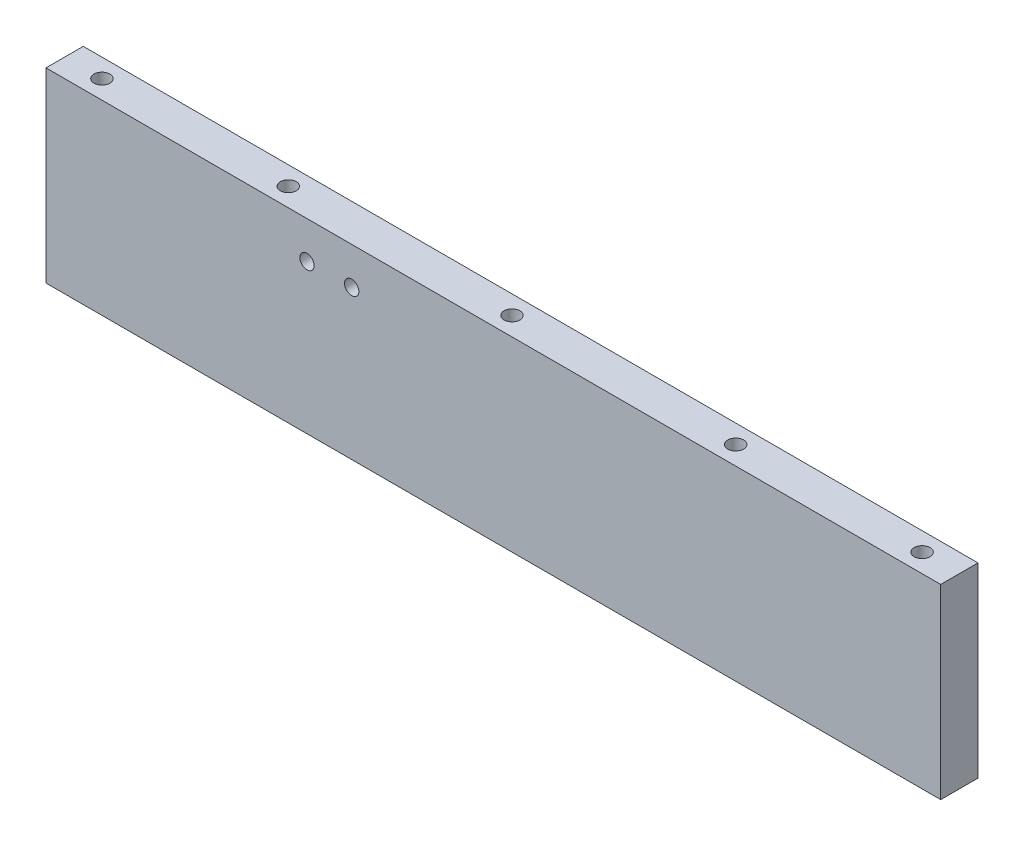
ISO-10303-21;
HEADER;
FILE_DESCRIPTION(('STEP AP214'),'2;1');
FILE_NAME('part.step','',(''),(''),'','','');
FILE_SCHEMA(('AUTOMOTIVE_DESIGN { 1 0 10303 214 1 1 1 1 }'));
ENDSEC;
DATA;
#1=APPLICATION_CONTEXT('core data for automotive mechanical design processes');
#2=APPLICATION_PROTOCOL_DEFINITION('international standard','automotive_design',2000,#1);
#3=PRODUCT_CONTEXT('',#1,'mechanical');
#4=PRODUCT('Part','Part','',(#3));
#5=PRODUCT_RELATED_PRODUCT_CATEGORY('part','',(#4));
#6=PRODUCT_DEFINITION_FORMATION('','',#4);
#7=PRODUCT_DEFINITION_CONTEXT('part definition',#1,'design');
#8=PRODUCT_DEFINITION('design','',#6,#7);
#9=PRODUCT_DEFINITION_SHAPE('','',#8);
#10=(LENGTH_UNIT() NAMED_UNIT(*) SI_UNIT(.MILLI.,.METRE.));
#11=(NAMED_UNIT(*) PLANE_ANGLE_UNIT() SI_UNIT($,.RADIAN.));
#12=(NAMED_UNIT(*) SI_UNIT($,.STERADIAN.) SOLID_ANGLE_UNIT());
#13=UNCERTAINTY_MEASURE_WITH_UNIT(LENGTH_MEASURE(1.E-05),#10,'distance_accuracy_value','');
#14=(GEOMETRIC_REPRESENTATION_CONTEXT(3) GLOBAL_UNCERTAINTY_ASSIGNED_CONTEXT((#13)) GLOBAL_UNIT_ASSIGNED_CONTEXT((#10,
#11,#12)) REPRESENTATION_CONTEXT('',''));
#15=CARTESIAN_POINT('',(0.,0.,0.));
#16=DIRECTION('',(0.,0.,1.));
#17=DIRECTION('',(1.,0.,0.));
#18=AXIS2_PLACEMENT_3D('',#15,#16,#17);
#19=CARTESIAN_POINT('',(76.2,-15.875,-6.35));
#20=DIRECTION('',(1.,0.,0.));
#21=DIRECTION('',(0.,0.,-1.));
#22=AXIS2_PLACEMENT_3D('',#19,#20,#21);
#23=PLANE('',#22);
#24=DIRECTION('',(0.,1.,0.));
#25=VECTOR('',#24,1.);
#26=CARTESIAN_POINT('',(76.2,-15.875,0.));
#27=LINE('',#26,#25);
#28=CARTESIAN_POINT('',(76.2,-15.875,0.));
#29=VERTEX_POINT('',#28);
#30=CARTESIAN_POINT('',(76.2,15.875,0.));
#31=VERTEX_POINT('',#30);
#32=EDGE_CURVE('E201',#29,#31,#27,.T.);
#33=ORIENTED_EDGE('',*,*,#32,.F.);
#34=DIRECTION('',(0.,0.,1.));
#35=VECTOR('',#34,1.);
#36=CARTESIAN_POINT('',(76.2,-15.875,-6.35));
#37=LINE('',#36,#35);
#38=CARTESIAN_POINT('',(76.2,-15.875,-6.35));
#39=VERTEX_POINT('',#38);
#40=EDGE_CURVE('E12',#39,#29,#37,.T.);
#41=ORIENTED_EDGE('',*,*,#40,.F.);
#42=DIRECTION('',(0.,1.,0.));
#43=VECTOR('',#42,1.);
#44=CARTESIAN_POINT('',(76.2,-15.875,-6.35));
#45=LINE('',#44,#43);
#46=CARTESIAN_POINT('',(76.2,15.875,-6.35));
#47=VERTEX_POINT('',#46);
#48=EDGE_CURVE('E202',#39,#47,#45,.T.);
#49=ORIENTED_EDGE('',*,*,#48,.T.);
#50=DIRECTION('',(0.,0.,1.));
#51=VECTOR('',#50,1.);
#52=CARTESIAN_POINT('',(76.2,15.875,-6.35));
#53=LINE('',#52,#51);
#54=EDGE_CURVE('E41',#47,#31,#53,.T.);
#55=ORIENTED_EDGE('',*,*,#54,.T.);
#56=EDGE_LOOP('',(#33,#41,#49,#55));
#57=FACE_BOUND('',#56,.T.);
#58=ADVANCED_FACE('F38',(#57),#23,.T.);
#59=CARTESIAN_POINT('',(-76.2,-15.875,-6.35));
#60=DIRECTION('',(0.,-1.,0.));
#61=DIRECTION('',(0.,0.,-1.));
#62=AXIS2_PLACEMENT_3D('',#59,#60,#61);
#63=PLANE('',#62);
#64=CARTESIAN_POINT('',(-69.85,-15.875,-3.175));
#65=DIRECTION('',(0.,-1.,0.));
#66=DIRECTION('',(0.,0.,-1.));
#67=AXIS2_PLACEMENT_3D('',#64,#65,#66);
#68=CIRCLE('',#67,1.35254999999999);
#69=CARTESIAN_POINT('',(-69.85,-15.875,-4.52754999999999));
#70=VERTEX_POINT('',#69);
#71=EDGE_CURVE('E125',#70,#70,#68,.T.);
#72=ORIENTED_EDGE('',*,*,#71,.F.);
#73=EDGE_LOOP('',(#72));
#74=FACE_BOUND('',#73,.T.);
#75=CARTESIAN_POINT('',(-38.1,-15.875,-3.175));
#76=DIRECTION('',(0.,-1.,0.));
#77=DIRECTION('',(0.,0.,-1.));
#78=AXIS2_PLACEMENT_3D('',#75,#76,#77);
#79=CIRCLE('',#78,1.35254999999999);
#80=CARTESIAN_POINT('',(-38.1,-15.875,-4.52754999999999));
#81=VERTEX_POINT('',#80);
#82=EDGE_CURVE('E124',#81,#81,#79,.T.);
#83=ORIENTED_EDGE('',*,*,#82,.F.);
#84=EDGE_LOOP('',(#83));
#85=FACE_BOUND('',#84,.T.);
#86=CARTESIAN_POINT('',(0.,-15.875,-3.175));
#87=DIRECTION('',(0.,-1.,0.));
#88=DIRECTION('',(0.,0.,-1.));
#89=AXIS2_PLACEMENT_3D('',#86,#87,#88);
#90=CIRCLE('',#89,1.35254999999999);
#91=CARTESIAN_POINT('',(0.,-15.875,-4.52754999999999));
#92=VERTEX_POINT('',#91);
#93=EDGE_CURVE('E135',#92,#92,#90,.T.);
#94=ORIENTED_EDGE('',*,*,#93,.F.);
#95=EDGE_LOOP('',(#94));
#96=FACE_BOUND('',#95,.T.);
#97=CARTESIAN_POINT('',(38.1,-15.875,-3.175));
#98=DIRECTION('',(0.,-1.,0.));
#99=DIRECTION('',(0.,0.,-1.));
#100=AXIS2_PLACEMENT_3D('',#97,#98,#99);
#101=CIRCLE('',#100,1.35254999999999);
#102=CARTESIAN_POINT('',(38.1,-15.875,-4.52754999999999));
#103=VERTEX_POINT('',#102);
#104=EDGE_CURVE('E141',#103,#103,#101,.T.);
#105=ORIENTED_EDGE('',*,*,#104,.F.);
#106=EDGE_LOOP('',(#105));
#107=FACE_BOUND('',#106,.T.);
#108=CARTESIAN_POINT('',(69.85,-15.875,-3.175));
#109=DIRECTION('',(0.,-1.,0.));
#110=DIRECTION('',(0.,0.,-1.));
#111=AXIS2_PLACEMENT_3D('',#108,#109,#110);
#112=CIRCLE('',#111,1.35254999999999);
#113=CARTESIAN_POINT('',(69.85,-15.875,-4.52754999999999));
#114=VERTEX_POINT('',#113);
#115=EDGE_CURVE('E147',#114,#114,#112,.T.);
#116=ORIENTED_EDGE('',*,*,#115,.F.);
#117=EDGE_LOOP('',(#116));
#118=FACE_BOUND('',#117,.T.);
#119=DIRECTION('',(1.,0.,0.));
#120=VECTOR('',#119,1.);
#121=CARTESIAN_POINT('',(-76.2,-15.875,0.));
#122=LINE('',#121,#120);
#123=CARTESIAN_POINT('',(-76.2,-15.875,0.));
#124=VERTEX_POINT('',#123);
#125=EDGE_CURVE('E205',#124,#29,#122,.T.);
#126=ORIENTED_EDGE('',*,*,#125,.F.);
#127=DIRECTION('',(0.,0.,1.));
#128=VECTOR('',#127,1.);
#129=CARTESIAN_POINT('',(-76.2,-15.875,-6.35));
#130=LINE('',#129,#128);
#131=CARTESIAN_POINT('',(-76.2,-15.875,-6.35));
#132=VERTEX_POINT('',#131);
#133=EDGE_CURVE('E47',#132,#124,#130,.T.);
#134=ORIENTED_EDGE('',*,*,#133,.F.);
#135=DIRECTION('',(1.,0.,0.));
#136=VECTOR('',#135,1.);
#137=CARTESIAN_POINT('',(-76.2,-15.875,-6.35));
#138=LINE('',#137,#136);
#139=EDGE_CURVE('E209',#132,#39,#138,.T.);
#140=ORIENTED_EDGE('',*,*,#139,.T.);
#141=ORIENTED_EDGE('',*,*,#40,.T.);
#142=EDGE_LOOP('',(#126,#134,#140,#141));
#143=FACE_BOUND('',#142,.T.);
#144=ADVANCED_FACE('F226',(#74,#85,#96,#107,#118,#143),#63,.T.);
#145=CARTESIAN_POINT('',(-76.2,-15.875,-6.35));
#146=DIRECTION('',(-1.,0.,0.));
#147=DIRECTION('',(0.,0.,1.));
#148=AXIS2_PLACEMENT_3D('',#145,#146,#147);
#149=PLANE('',#148);
#150=DIRECTION('',(0.,-1.,0.));
#151=VECTOR('',#150,1.);
#152=CARTESIAN_POINT('',(-76.2,-15.875,0.));
#153=LINE('',#152,#151);
#154=CARTESIAN_POINT('',(-76.2,15.875,0.));
#155=VERTEX_POINT('',#154);
#156=EDGE_CURVE('E217',#155,#124,#153,.T.);
#157=ORIENTED_EDGE('',*,*,#156,.F.);
#158=DIRECTION('',(0.,0.,1.));
#159=VECTOR('',#158,1.);
#160=CARTESIAN_POINT('',(-76.2,15.875,-6.35));
#161=LINE('',#160,#159);
#162=CARTESIAN_POINT('',(-76.2,15.875,-6.35));
#163=VERTEX_POINT('',#162);
#164=EDGE_CURVE('E222',#163,#155,#161,.T.);
#165=ORIENTED_EDGE('',*,*,#164,.F.);
#166=DIRECTION('',(0.,-1.,0.));
#167=VECTOR('',#166,1.);
#168=CARTESIAN_POINT('',(-76.2,-15.875,-6.35));
#169=LINE('',#168,#167);
#170=EDGE_CURVE('E207',#163,#132,#169,.T.);
#171=ORIENTED_EDGE('',*,*,#170,.T.);
#172=ORIENTED_EDGE('',*,*,#133,.T.);
#173=EDGE_LOOP('',(#157,#165,#171,#172));
#174=FACE_BOUND('',#173,.T.);
#175=ADVANCED_FACE('F229',(#174),#149,.T.);
#176=CARTESIAN_POINT('',(-76.2,15.875,-6.35));
#177=DIRECTION('',(0.,1.,0.));
#178=DIRECTION('',(0.,0.,1.));
#179=AXIS2_PLACEMENT_3D('',#176,#177,#178);
#180=PLANE('',#179);
#181=CARTESIAN_POINT('',(-69.85,15.875,-3.175));
#182=DIRECTION('',(0.,1.,0.));
#183=DIRECTION('',(0.,0.,1.));
#184=AXIS2_PLACEMENT_3D('',#181,#182,#183);
#185=CIRCLE('',#184,1.35254999999999);
#186=CARTESIAN_POINT('',(-69.85,15.875,-1.82245000000001));
#187=VERTEX_POINT('',#186);
#188=EDGE_CURVE('E153',#187,#187,#185,.T.);
#189=ORIENTED_EDGE('',*,*,#188,.F.);
#190=EDGE_LOOP('',(#189));
#191=FACE_BOUND('',#190,.T.);
#192=CARTESIAN_POINT('',(-38.1,15.875,-3.175));
#193=DIRECTION('',(0.,1.,0.));
#194=DIRECTION('',(0.,0.,1.));
#195=AXIS2_PLACEMENT_3D('',#192,#193,#194);
#196=CIRCLE('',#195,1.35254999999999);
#197=CARTESIAN_POINT('',(-38.1,15.875,-1.82245000000001));
#198=VERTEX_POINT('',#197);
#199=EDGE_CURVE('E159',#198,#198,#196,.T.);
#200=ORIENTED_EDGE('',*,*,#199,.F.);
#201=EDGE_LOOP('',(#200));
#202=FACE_BOUND('',#201,.T.);
#203=CARTESIAN_POINT('',(0.,15.875,-3.175));
#204=DIRECTION('',(0.,1.,0.));
#205=DIRECTION('',(0.,0.,1.));
#206=AXIS2_PLACEMENT_3D('',#203,#204,#205);
#207=CIRCLE('',#206,1.35254999999999);
#208=CARTESIAN_POINT('',(0.,15.875,-1.82245000000001));
#209=VERTEX_POINT('',#208);
#210=EDGE_CURVE('E165',#209,#209,#207,.T.);
#211=ORIENTED_EDGE('',*,*,#210,.F.);
#212=EDGE_LOOP('',(#211));
#213=FACE_BOUND('',#212,.T.);
#214=CARTESIAN_POINT('',(38.1,15.875,-3.175));
#215=DIRECTION('',(0.,1.,0.));
#216=DIRECTION('',(0.,0.,1.));
#217=AXIS2_PLACEMENT_3D('',#214,#215,#216);
#218=CIRCLE('',#217,1.35254999999999);
#219=CARTESIAN_POINT('',(38.1,15.875,-1.82245000000001));
#220=VERTEX_POINT('',#219);
#221=EDGE_CURVE('E171',#220,#220,#218,.T.);
#222=ORIENTED_EDGE('',*,*,#221,.F.);
#223=EDGE_LOOP('',(#222));
#224=FACE_BOUND('',#223,.T.);
#225=CARTESIAN_POINT('',(69.85,15.875,-3.175));
#226=DIRECTION('',(0.,1.,0.));
#227=DIRECTION('',(0.,0.,1.));
#228=AXIS2_PLACEMENT_3D('',#225,#226,#227);
#229=CIRCLE('',#228,1.35254999999999);
#230=CARTESIAN_POINT('',(69.85,15.875,-1.82245000000001));
#231=VERTEX_POINT('',#230);
#232=EDGE_CURVE('E177',#231,#231,#229,.T.);
#233=ORIENTED_EDGE('',*,*,#232,.F.);
#234=EDGE_LOOP('',(#233));
#235=FACE_BOUND('',#234,.T.);
#236=DIRECTION('',(-1.,0.,0.));
#237=VECTOR('',#236,1.);
#238=CARTESIAN_POINT('',(-76.2,15.875,0.));
#239=LINE('',#238,#237);
#240=EDGE_CURVE('E213',#31,#155,#239,.T.);
#241=ORIENTED_EDGE('',*,*,#240,.F.);
#242=ORIENTED_EDGE('',*,*,#54,.F.);
#243=DIRECTION('',(-1.,0.,0.));
#244=VECTOR('',#243,1.);
#245=CARTESIAN_POINT('',(-76.2,15.875,-6.35));
#246=LINE('',#245,#244);
#247=EDGE_CURVE('E204',#47,#163,#246,.T.);
#248=ORIENTED_EDGE('',*,*,#247,.T.);
#249=ORIENTED_EDGE('',*,*,#164,.T.);
#250=EDGE_LOOP('',(#241,#242,#248,#249));
#251=FACE_BOUND('',#250,.T.);
#252=ADVANCED_FACE('F223',(#191,#202,#213,#224,#235,#251),#180,.T.);
#253=CARTESIAN_POINT('',(0.,0.,-6.35));
#254=DIRECTION('',(0.,0.,-1.));
#255=DIRECTION('',(-1.,0.,0.));
#256=AXIS2_PLACEMENT_3D('',#253,#254,#255);
#257=PLANE('',#256);
#258=CARTESIAN_POINT('',(-31.75,9.525,-6.35));
#259=DIRECTION('',(0.,0.,-1.));
#260=DIRECTION('',(-1.,0.,0.));
#261=AXIS2_PLACEMENT_3D('',#258,#259,#260);
#262=CIRCLE('',#261,1.2192);
#263=CARTESIAN_POINT('',(-32.9692,9.525,-6.35));
#264=VERTEX_POINT('',#263);
#265=EDGE_CURVE('E187',#264,#264,#262,.T.);
#266=ORIENTED_EDGE('',*,*,#265,.F.);
#267=EDGE_LOOP('',(#266));
#268=FACE_BOUND('',#267,.T.);
#269=CARTESIAN_POINT('',(-24.13,9.525,-6.35));
#270=DIRECTION('',(0.,0.,-1.));
#271=DIRECTION('',(-1.,0.,0.));
#272=AXIS2_PLACEMENT_3D('',#269,#270,#271);
#273=CIRCLE('',#272,1.2192);
#274=CARTESIAN_POINT('',(-25.3492,9.525,-6.35));
#275=VERTEX_POINT('',#274);
#276=EDGE_CURVE('E198',#275,#275,#273,.T.);
#277=ORIENTED_EDGE('',*,*,#276,.F.);
#278=EDGE_LOOP('',(#277));
#279=FACE_BOUND('',#278,.T.);
#280=ORIENTED_EDGE('',*,*,#48,.F.);
#281=ORIENTED_EDGE('',*,*,#139,.F.);
#282=ORIENTED_EDGE('',*,*,#170,.F.);
#283=ORIENTED_EDGE('',*,*,#247,.F.);
#284=EDGE_LOOP('',(#280,#281,#282,#283));
#285=FACE_BOUND('',#284,.T.);
#286=ADVANCED_FACE('F231',(#268,#279,#285),#257,.T.);
#287=CARTESIAN_POINT('',(0.,0.,0.));
#288=DIRECTION('',(0.,0.,-1.));
#289=DIRECTION('',(-1.,0.,0.));
#290=AXIS2_PLACEMENT_3D('',#287,#288,#289);
#291=PLANE('',#290);
#292=CARTESIAN_POINT('',(-31.75,9.525,0.));
#293=DIRECTION('',(0.,0.,1.));
#294=DIRECTION('',(1.,0.,0.));
#295=AXIS2_PLACEMENT_3D('',#292,#293,#294);
#296=CIRCLE('',#295,1.2192);
#297=CARTESIAN_POINT('',(-30.5308,9.525,0.));
#298=VERTEX_POINT('',#297);
#299=EDGE_CURVE('E183',#298,#298,#296,.T.);
#300=ORIENTED_EDGE('',*,*,#299,.F.);
#301=EDGE_LOOP('',(#300));
#302=FACE_BOUND('',#301,.T.);
#303=CARTESIAN_POINT('',(-24.13,9.525,0.));
#304=DIRECTION('',(0.,0.,1.));
#305=DIRECTION('',(1.,0.,0.));
#306=AXIS2_PLACEMENT_3D('',#303,#304,#305);
#307=CIRCLE('',#306,1.2192);
#308=CARTESIAN_POINT('',(-22.9108,9.525,0.));
#309=VERTEX_POINT('',#308);
#310=EDGE_CURVE('E194',#309,#309,#307,.T.);
#311=ORIENTED_EDGE('',*,*,#310,.F.);
#312=EDGE_LOOP('',(#311));
#313=FACE_BOUND('',#312,.T.);
#314=ORIENTED_EDGE('',*,*,#32,.T.);
#315=ORIENTED_EDGE('',*,*,#240,.T.);
#316=ORIENTED_EDGE('',*,*,#156,.T.);
#317=ORIENTED_EDGE('',*,*,#125,.T.);
#318=EDGE_LOOP('',(#314,#315,#316,#317));
#319=FACE_BOUND('',#318,.T.);
#320=ADVANCED_FACE('F225',(#302,#313,#319),#291,.F.);
#321=CARTESIAN_POINT('',(-24.13,9.525,0.));
#322=DIRECTION('',(0.,0.,1.));
#323=DIRECTION('',(1.,0.,0.));
#324=AXIS2_PLACEMENT_3D('',#321,#322,#323);
#325=CYLINDRICAL_SURFACE('',#324,1.2192);
#326=ORIENTED_EDGE('',*,*,#310,.T.);
#327=EDGE_LOOP('',(#326));
#328=FACE_BOUND('',#327,.T.);
#329=ORIENTED_EDGE('',*,*,#276,.T.);
#330=EDGE_LOOP('',(#329));
#331=FACE_BOUND('',#330,.T.);
#332=ADVANCED_FACE('F239',(#328,#331),#325,.F.);
#333=CARTESIAN_POINT('',(-31.75,9.525,0.));
#334=DIRECTION('',(0.,0.,1.));
#335=DIRECTION('',(1.,0.,0.));
#336=AXIS2_PLACEMENT_3D('',#333,#334,#335);
#337=CYLINDRICAL_SURFACE('',#336,1.2192);
#338=ORIENTED_EDGE('',*,*,#299,.T.);
#339=EDGE_LOOP('',(#338));
#340=FACE_BOUND('',#339,.T.);
#341=ORIENTED_EDGE('',*,*,#265,.T.);
#342=EDGE_LOOP('',(#341));
#343=FACE_BOUND('',#342,.T.);
#344=ADVANCED_FACE('F323',(#340,#343),#337,.F.);
#345=CARTESIAN_POINT('',(69.85,3.175,-3.175));
#346=DIRECTION('',(0.,1.,0.));
#347=DIRECTION('',(0.,0.,1.));
#348=AXIS2_PLACEMENT_3D('',#345,#346,#347);
#349=CONICAL_SURFACE('',#348,1.35254999999999,1.02974425867665);
#350=CARTESIAN_POINT('',(69.85,2.36230596973428,-3.175));
#351=VERTEX_POINT('',#350);
#352=VERTEX_LOOP('',#351);
#353=FACE_BOUND('',#352,.T.);
#354=CARTESIAN_POINT('',(69.85,3.175,-3.175));
#355=DIRECTION('',(0.,1.,0.));
#356=DIRECTION('',(0.,0.,1.));
#357=AXIS2_PLACEMENT_3D('',#354,#355,#356);
#358=CIRCLE('',#357,1.35254999999999);
#359=CARTESIAN_POINT('',(69.85,3.175,-1.82245000000001));
#360=VERTEX_POINT('',#359);
#361=EDGE_CURVE('E180',#360,#360,#358,.T.);
#362=ORIENTED_EDGE('',*,*,#361,.T.);
#363=EDGE_LOOP('',(#362));
#364=FACE_BOUND('',#363,.T.);
#365=ADVANCED_FACE('F319',(#353,#364),#349,.F.);
#366=CARTESIAN_POINT('',(69.85,15.875,-3.175));
#367=DIRECTION('',(0.,1.,0.));
#368=DIRECTION('',(0.,0.,1.));
#369=AXIS2_PLACEMENT_3D('',#366,#367,#368);
#370=CYLINDRICAL_SURFACE('',#369,1.35254999999999);
#371=ORIENTED_EDGE('',*,*,#361,.F.);
#372=EDGE_LOOP('',(#371));
#373=FACE_BOUND('',#372,.T.);
#374=ORIENTED_EDGE('',*,*,#232,.T.);
#375=EDGE_LOOP('',(#374));
#376=FACE_BOUND('',#375,.T.);
#377=ADVANCED_FACE('F315',(#373,#376),#370,.F.);
#378=CARTESIAN_POINT('',(38.1,3.175,-3.175));
#379=DIRECTION('',(0.,1.,0.));
#380=DIRECTION('',(0.,0.,1.));
#381=AXIS2_PLACEMENT_3D('',#378,#379,#380);
#382=CONICAL_SURFACE('',#381,1.35254999999999,1.02974425867665);
#383=CARTESIAN_POINT('',(38.1,2.36230596973428,-3.175));
#384=VERTEX_POINT('',#383);
#385=VERTEX_LOOP('',#384);
#386=FACE_BOUND('',#385,.T.);
#387=CARTESIAN_POINT('',(38.1,3.175,-3.175));
#388=DIRECTION('',(0.,1.,0.));
#389=DIRECTION('',(0.,0.,1.));
#390=AXIS2_PLACEMENT_3D('',#387,#388,#389);
#391=CIRCLE('',#390,1.35254999999999);
#392=CARTESIAN_POINT('',(38.1,3.175,-1.82245000000001));
#393=VERTEX_POINT('',#392);
#394=EDGE_CURVE('E174',#393,#393,#391,.T.);
#395=ORIENTED_EDGE('',*,*,#394,.T.);
#396=EDGE_LOOP('',(#395));
#397=FACE_BOUND('',#396,.T.);
#398=ADVANCED_FACE('F311',(#386,#397),#382,.F.);
#399=CARTESIAN_POINT('',(38.1,15.875,-3.175));
#400=DIRECTION('',(0.,1.,0.));
#401=DIRECTION('',(0.,0.,1.));
#402=AXIS2_PLACEMENT_3D('',#399,#400,#401);
#403=CYLINDRICAL_SURFACE('',#402,1.35254999999999);
#404=ORIENTED_EDGE('',*,*,#394,.F.);
#405=EDGE_LOOP('',(#404));
#406=FACE_BOUND('',#405,.T.);
#407=ORIENTED_EDGE('',*,*,#221,.T.);
#408=EDGE_LOOP('',(#407));
#409=FACE_BOUND('',#408,.T.);
#410=ADVANCED_FACE('F307',(#406,#409),#403,.F.);
#411=CARTESIAN_POINT('',(0.,3.175,-3.175));
#412=DIRECTION('',(0.,1.,0.));
#413=DIRECTION('',(0.,0.,1.));
#414=AXIS2_PLACEMENT_3D('',#411,#412,#413);
#415=CONICAL_SURFACE('',#414,1.35255,1.02974425867665);
#416=CARTESIAN_POINT('',(0.,2.36230596973428,-3.175));
#417=VERTEX_POINT('',#416);
#418=VERTEX_LOOP('',#417);
#419=FACE_BOUND('',#418,.T.);
#420=CARTESIAN_POINT('',(0.,3.175,-3.175));
#421=DIRECTION('',(0.,1.,0.));
#422=DIRECTION('',(0.,0.,1.));
#423=AXIS2_PLACEMENT_3D('',#420,#421,#422);
#424=CIRCLE('',#423,1.35255);
#425=CARTESIAN_POINT('',(0.,3.175,-1.82245));
#426=VERTEX_POINT('',#425);
#427=EDGE_CURVE('E168',#426,#426,#424,.T.);
#428=ORIENTED_EDGE('',*,*,#427,.T.);
#429=EDGE_LOOP('',(#428));
#430=FACE_BOUND('',#429,.T.);
#431=ADVANCED_FACE('F303',(#419,#430),#415,.F.);
#432=CARTESIAN_POINT('',(0.,15.875,-3.175));
#433=DIRECTION('',(0.,1.,0.));
#434=DIRECTION('',(0.,0.,1.));
#435=AXIS2_PLACEMENT_3D('',#432,#433,#434);
#436=CYLINDRICAL_SURFACE('',#435,1.35254999999999);
#437=ORIENTED_EDGE('',*,*,#427,.F.);
#438=EDGE_LOOP('',(#437));
#439=FACE_BOUND('',#438,.T.);
#440=ORIENTED_EDGE('',*,*,#210,.T.);
#441=EDGE_LOOP('',(#440));
#442=FACE_BOUND('',#441,.T.);
#443=ADVANCED_FACE('F299',(#439,#442),#436,.F.);
#444=CARTESIAN_POINT('',(-38.1,3.175,-3.175));
#445=DIRECTION('',(0.,1.,0.));
#446=DIRECTION('',(0.,0.,1.));
#447=AXIS2_PLACEMENT_3D('',#444,#445,#446);
#448=CONICAL_SURFACE('',#447,1.35254999999999,1.02974425867665);
#449=CARTESIAN_POINT('',(-38.1,2.36230596973428,-3.175));
#450=VERTEX_POINT('',#449);
#451=VERTEX_LOOP('',#450);
#452=FACE_BOUND('',#451,.T.);
#453=CARTESIAN_POINT('',(-38.1,3.175,-3.175));
#454=DIRECTION('',(0.,1.,0.));
#455=DIRECTION('',(0.,0.,1.));
#456=AXIS2_PLACEMENT_3D('',#453,#454,#455);
#457=CIRCLE('',#456,1.35254999999999);
#458=CARTESIAN_POINT('',(-38.1,3.175,-1.82245000000001));
#459=VERTEX_POINT('',#458);
#460=EDGE_CURVE('E162',#459,#459,#457,.T.);
#461=ORIENTED_EDGE('',*,*,#460,.T.);
#462=EDGE_LOOP('',(#461));
#463=FACE_BOUND('',#462,.T.);
#464=ADVANCED_FACE('F295',(#452,#463),#448,.F.);
#465=CARTESIAN_POINT('',(-38.1,15.875,-3.175));
#466=DIRECTION('',(0.,1.,0.));
#467=DIRECTION('',(0.,0.,1.));
#468=AXIS2_PLACEMENT_3D('',#465,#466,#467);
#469=CYLINDRICAL_SURFACE('',#468,1.35254999999999);
#470=ORIENTED_EDGE('',*,*,#460,.F.);
#471=EDGE_LOOP('',(#470));
#472=FACE_BOUND('',#471,.T.);
#473=ORIENTED_EDGE('',*,*,#199,.T.);
#474=EDGE_LOOP('',(#473));
#475=FACE_BOUND('',#474,.T.);
#476=ADVANCED_FACE('F291',(#472,#475),#469,.F.);
#477=CARTESIAN_POINT('',(-69.85,3.175,-3.175));
#478=DIRECTION('',(0.,1.,0.));
#479=DIRECTION('',(0.,0.,1.));
#480=AXIS2_PLACEMENT_3D('',#477,#478,#479);
#481=CONICAL_SURFACE('',#480,1.35254999999999,1.02974425867665);
#482=CARTESIAN_POINT('',(-69.85,2.36230596973428,-3.175));
#483=VERTEX_POINT('',#482);
#484=VERTEX_LOOP('',#483);
#485=FACE_BOUND('',#484,.T.);
#486=CARTESIAN_POINT('',(-69.85,3.175,-3.175));
#487=DIRECTION('',(0.,1.,0.));
#488=DIRECTION('',(0.,0.,1.));
#489=AXIS2_PLACEMENT_3D('',#486,#487,#488);
#490=CIRCLE('',#489,1.35254999999999);
#491=CARTESIAN_POINT('',(-69.85,3.175,-1.82245000000001));
#492=VERTEX_POINT('',#491);
#493=EDGE_CURVE('E156',#492,#492,#490,.T.);
#494=ORIENTED_EDGE('',*,*,#493,.T.);
#495=EDGE_LOOP('',(#494));
#496=FACE_BOUND('',#495,.T.);
#497=ADVANCED_FACE('F287',(#485,#496),#481,.F.);
#498=CARTESIAN_POINT('',(-69.85,15.875,-3.175));
#499=DIRECTION('',(0.,1.,0.));
#500=DIRECTION('',(0.,0.,1.));
#501=AXIS2_PLACEMENT_3D('',#498,#499,#500);
#502=CYLINDRICAL_SURFACE('',#501,1.35254999999999);
#503=ORIENTED_EDGE('',*,*,#493,.F.);
#504=EDGE_LOOP('',(#503));
#505=FACE_BOUND('',#504,.T.);
#506=ORIENTED_EDGE('',*,*,#188,.T.);
#507=EDGE_LOOP('',(#506));
#508=FACE_BOUND('',#507,.T.);
#509=ADVANCED_FACE('F279',(#505,#508),#502,.F.);
#510=CARTESIAN_POINT('',(69.85,-3.175,-3.175));
#511=DIRECTION('',(0.,-1.,0.));
#512=DIRECTION('',(0.,0.,-1.));
#513=AXIS2_PLACEMENT_3D('',#510,#511,#512);
#514=CONICAL_SURFACE('',#513,1.35254999999999,1.02974425867665);
#515=CARTESIAN_POINT('',(69.85,-2.36230596973428,-3.175));
#516=VERTEX_POINT('',#515);
#517=VERTEX_LOOP('',#516);
#518=FACE_BOUND('',#517,.T.);
#519=CARTESIAN_POINT('',(69.85,-3.175,-3.175));
#520=DIRECTION('',(0.,-1.,0.));
#521=DIRECTION('',(0.,0.,-1.));
#522=AXIS2_PLACEMENT_3D('',#519,#520,#521);
#523=CIRCLE('',#522,1.35254999999999);
#524=CARTESIAN_POINT('',(69.85,-3.175,-4.52754999999999));
#525=VERTEX_POINT('',#524);
#526=EDGE_CURVE('E150',#525,#525,#523,.T.);
#527=ORIENTED_EDGE('',*,*,#526,.T.);
#528=EDGE_LOOP('',(#527));
#529=FACE_BOUND('',#528,.T.);
#530=ADVANCED_FACE('F269',(#518,#529),#514,.F.);
#531=CARTESIAN_POINT('',(69.85,-15.875,-3.175));
#532=DIRECTION('',(0.,-1.,0.));
#533=DIRECTION('',(0.,0.,-1.));
#534=AXIS2_PLACEMENT_3D('',#531,#532,#533);
#535=CYLINDRICAL_SURFACE('',#534,1.35254999999999);
#536=ORIENTED_EDGE('',*,*,#526,.F.);
#537=EDGE_LOOP('',(#536));
#538=FACE_BOUND('',#537,.T.);
#539=ORIENTED_EDGE('',*,*,#115,.T.);
#540=EDGE_LOOP('',(#539));
#541=FACE_BOUND('',#540,.T.);
#542=ADVANCED_FACE('F266',(#538,#541),#535,.F.);
#543=CARTESIAN_POINT('',(38.1,-3.175,-3.175));
#544=DIRECTION('',(0.,-1.,0.));
#545=DIRECTION('',(0.,0.,-1.));
#546=AXIS2_PLACEMENT_3D('',#543,#544,#545);
#547=CONICAL_SURFACE('',#546,1.35254999999999,1.02974425867665);
#548=CARTESIAN_POINT('',(38.1,-2.36230596973428,-3.175));
#549=VERTEX_POINT('',#548);
#550=VERTEX_LOOP('',#549);
#551=FACE_BOUND('',#550,.T.);
#552=CARTESIAN_POINT('',(38.1,-3.175,-3.175));
#553=DIRECTION('',(0.,-1.,0.));
#554=DIRECTION('',(0.,0.,-1.));
#555=AXIS2_PLACEMENT_3D('',#552,#553,#554);
#556=CIRCLE('',#555,1.35254999999999);
#557=CARTESIAN_POINT('',(38.1,-3.175,-4.52754999999999));
#558=VERTEX_POINT('',#557);
#559=EDGE_CURVE('E144',#558,#558,#556,.T.);
#560=ORIENTED_EDGE('',*,*,#559,.T.);
#561=EDGE_LOOP('',(#560));
#562=FACE_BOUND('',#561,.T.);
#563=ADVANCED_FACE('F268',(#551,#562),#547,.F.);
#564=CARTESIAN_POINT('',(38.1,-15.875,-3.175));
#565=DIRECTION('',(0.,-1.,0.));
#566=DIRECTION('',(0.,0.,-1.));
#567=AXIS2_PLACEMENT_3D('',#564,#565,#566);
#568=CYLINDRICAL_SURFACE('',#567,1.35254999999999);
#569=ORIENTED_EDGE('',*,*,#559,.F.);
#570=EDGE_LOOP('',(#569));
#571=FACE_BOUND('',#570,.T.);
#572=ORIENTED_EDGE('',*,*,#104,.T.);
#573=EDGE_LOOP('',(#572));
#574=FACE_BOUND('',#573,.T.);
#575=ADVANCED_FACE('F276',(#571,#574),#568,.F.);
#576=CARTESIAN_POINT('',(0.,-3.175,-3.175));
#577=DIRECTION('',(0.,-1.,0.));
#578=DIRECTION('',(0.,0.,-1.));
#579=AXIS2_PLACEMENT_3D('',#576,#577,#578);
#580=CONICAL_SURFACE('',#579,1.35255,1.02974425867665);
#581=CARTESIAN_POINT('',(0.,-2.36230596973428,-3.175));
#582=VERTEX_POINT('',#581);
#583=VERTEX_LOOP('',#582);
#584=FACE_BOUND('',#583,.T.);
#585=CARTESIAN_POINT('',(0.,-3.175,-3.175));
#586=DIRECTION('',(0.,-1.,0.));
#587=DIRECTION('',(0.,0.,-1.));
#588=AXIS2_PLACEMENT_3D('',#585,#586,#587);
#589=CIRCLE('',#588,1.35255);
#590=CARTESIAN_POINT('',(0.,-3.175,-4.52755));
#591=VERTEX_POINT('',#590);
#592=EDGE_CURVE('E138',#591,#591,#589,.T.);
#593=ORIENTED_EDGE('',*,*,#592,.T.);
#594=EDGE_LOOP('',(#593));
#595=FACE_BOUND('',#594,.T.);
#596=ADVANCED_FACE('F407',(#584,#595),#580,.F.);
#597=CARTESIAN_POINT('',(0.,-15.875,-3.175));
#598=DIRECTION('',(0.,-1.,0.));
#599=DIRECTION('',(0.,0.,-1.));
#600=AXIS2_PLACEMENT_3D('',#597,#598,#599);
#601=CYLINDRICAL_SURFACE('',#600,1.35254999999999);
#602=ORIENTED_EDGE('',*,*,#592,.F.);
#603=EDGE_LOOP('',(#602));
#604=FACE_BOUND('',#603,.T.);
#605=ORIENTED_EDGE('',*,*,#93,.T.);
#606=EDGE_LOOP('',(#605));
#607=FACE_BOUND('',#606,.T.);
#608=ADVANCED_FACE('F416',(#604,#607),#601,.F.);
#609=CARTESIAN_POINT('',(-38.1,-3.175,-3.175));
#610=DIRECTION('',(0.,-1.,0.));
#611=DIRECTION('',(0.,0.,-1.));
#612=AXIS2_PLACEMENT_3D('',#609,#610,#611);
#613=CONICAL_SURFACE('',#612,1.35254999999999,1.02974425867665);
#614=CARTESIAN_POINT('',(-38.1,-2.36230596973428,-3.175));
#615=VERTEX_POINT('',#614);
#616=VERTEX_LOOP('',#615);
#617=FACE_BOUND('',#616,.T.);
#618=CARTESIAN_POINT('',(-38.1,-3.175,-3.175));
#619=DIRECTION('',(0.,-1.,0.));
#620=DIRECTION('',(0.,0.,-1.));
#621=AXIS2_PLACEMENT_3D('',#618,#619,#620);
#622=CIRCLE('',#621,1.35254999999999);
#623=CARTESIAN_POINT('',(-38.1,-3.175,-4.52754999999999));
#624=VERTEX_POINT('',#623);
#625=EDGE_CURVE('E128',#624,#624,#622,.T.);
#626=ORIENTED_EDGE('',*,*,#625,.T.);
#627=EDGE_LOOP('',(#626));
#628=FACE_BOUND('',#627,.T.);
#629=ADVANCED_FACE('F426',(#617,#628),#613,.F.);
#630=CARTESIAN_POINT('',(-38.1,-15.875,-3.175));
#631=DIRECTION('',(0.,-1.,0.));
#632=DIRECTION('',(0.,0.,-1.));
#633=AXIS2_PLACEMENT_3D('',#630,#631,#632);
#634=CYLINDRICAL_SURFACE('',#633,1.35254999999999);
#635=ORIENTED_EDGE('',*,*,#625,.F.);
#636=EDGE_LOOP('',(#635));
#637=FACE_BOUND('',#636,.T.);
#638=ORIENTED_EDGE('',*,*,#82,.T.);
#639=EDGE_LOOP('',(#638));
#640=FACE_BOUND('',#639,.T.);
#641=ADVANCED_FACE('F118',(#637,#640),#634,.F.);
#642=CARTESIAN_POINT('',(-69.85,-3.175,-3.175));
#643=DIRECTION('',(0.,-1.,0.));
#644=DIRECTION('',(0.,0.,-1.));
#645=AXIS2_PLACEMENT_3D('',#642,#643,#644);
#646=CONICAL_SURFACE('',#645,1.35254999999999,1.02974425867665);
#647=CARTESIAN_POINT('',(-69.85,-2.36230596973428,-3.175));
#648=VERTEX_POINT('',#647);
#649=VERTEX_LOOP('',#648);
#650=FACE_BOUND('',#649,.T.);
#651=CARTESIAN_POINT('',(-69.85,-3.175,-3.175));
#652=DIRECTION('',(0.,-1.,0.));
#653=DIRECTION('',(0.,0.,-1.));
#654=AXIS2_PLACEMENT_3D('',#651,#652,#653);
#655=CIRCLE('',#654,1.35254999999999);
#656=CARTESIAN_POINT('',(-69.85,-3.175,-4.52754999999999));
#657=VERTEX_POINT('',#656);
#658=EDGE_CURVE('E122',#657,#657,#655,.T.);
#659=ORIENTED_EDGE('',*,*,#658,.T.);
#660=EDGE_LOOP('',(#659));
#661=FACE_BOUND('',#660,.T.);
#662=ADVANCED_FACE('F114',(#650,#661),#646,.F.);
#663=CARTESIAN_POINT('',(-69.85,-15.875,-3.175));
#664=DIRECTION('',(0.,-1.,0.));
#665=DIRECTION('',(0.,0.,-1.));
#666=AXIS2_PLACEMENT_3D('',#663,#664,#665);
#667=CYLINDRICAL_SURFACE('',#666,1.35254999999999);
#668=ORIENTED_EDGE('',*,*,#658,.F.);
#669=EDGE_LOOP('',(#668));
#670=FACE_BOUND('',#669,.T.);
#671=ORIENTED_EDGE('',*,*,#71,.T.);
#672=EDGE_LOOP('',(#671));
#673=FACE_BOUND('',#672,.T.);
#674=ADVANCED_FACE('F117',(#670,#673),#667,.F.);
#675=CLOSED_SHELL('',(#58,#144,#175,#252,#286,#320,#332,#344,#365,#377,#398,#410,#431,#443,#464,
#476,#497,#509,#530,#542,#563,#575,#596,#608,#629,#641,#662,#674));
#676=MANIFOLD_SOLID_BREP('B2',#675);
#677=ADVANCED_BREP_SHAPE_REPRESENTATION('',(#18,#676),#14);
#678=SHAPE_DEFINITION_REPRESENTATION(#9,#677);
ENDSEC;
END-ISO-10303-21;
